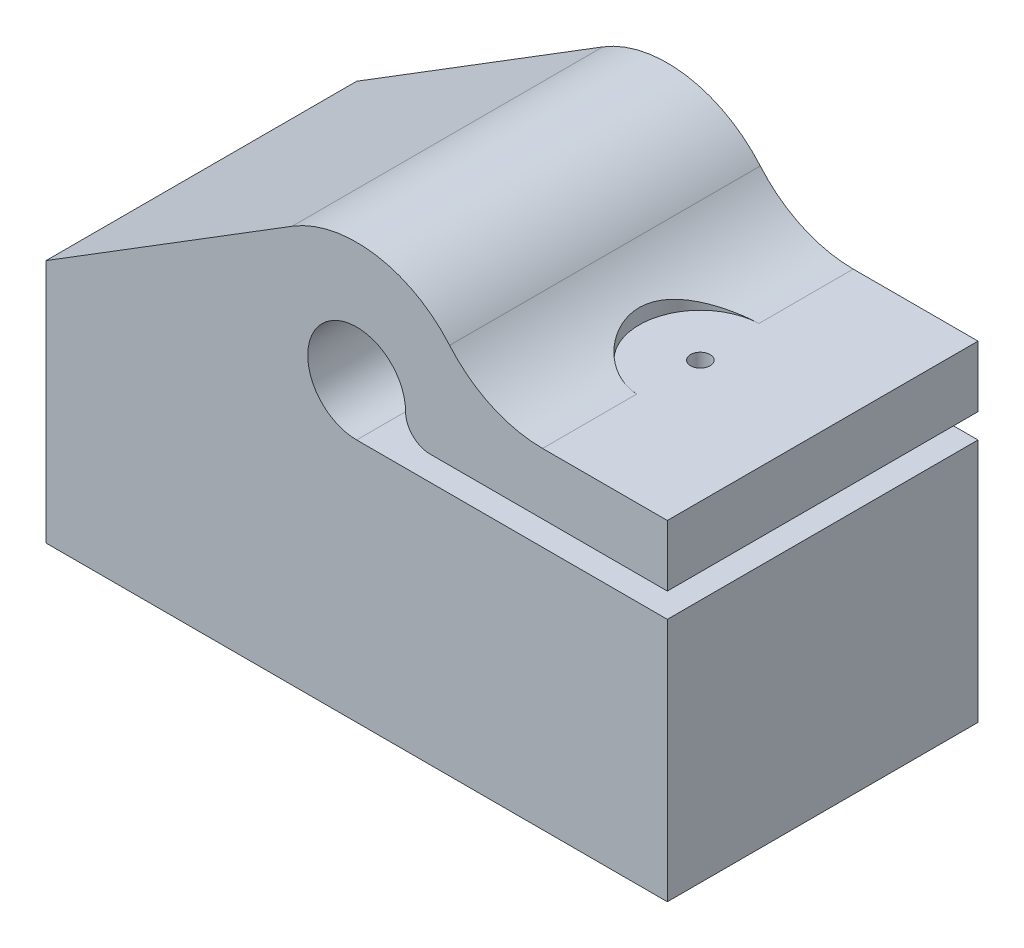
ISO-10303-21;
HEADER;
FILE_DESCRIPTION(('STEP AP214'),'2;1');
FILE_NAME('part.step','',(''),(''),'','','');
FILE_SCHEMA(('AUTOMOTIVE_DESIGN { 1 0 10303 214 1 1 1 1 }'));
ENDSEC;
DATA;
#1=APPLICATION_CONTEXT('core data for automotive mechanical design processes');
#2=APPLICATION_PROTOCOL_DEFINITION('international standard','automotive_design',2000,#1);
#3=PRODUCT_CONTEXT('',#1,'mechanical');
#4=PRODUCT('Part','Part','',(#3));
#5=PRODUCT_RELATED_PRODUCT_CATEGORY('part','',(#4));
#6=PRODUCT_DEFINITION_FORMATION('','',#4);
#7=PRODUCT_DEFINITION_CONTEXT('part definition',#1,'design');
#8=PRODUCT_DEFINITION('design','',#6,#7);
#9=PRODUCT_DEFINITION_SHAPE('','',#8);
#10=(LENGTH_UNIT() NAMED_UNIT(*) SI_UNIT(.MILLI.,.METRE.));
#11=(NAMED_UNIT(*) PLANE_ANGLE_UNIT() SI_UNIT($,.RADIAN.));
#12=(NAMED_UNIT(*) SI_UNIT($,.STERADIAN.) SOLID_ANGLE_UNIT());
#13=UNCERTAINTY_MEASURE_WITH_UNIT(LENGTH_MEASURE(1.E-05),#10,'distance_accuracy_value','');
#14=(GEOMETRIC_REPRESENTATION_CONTEXT(3) GLOBAL_UNCERTAINTY_ASSIGNED_CONTEXT((#13)) GLOBAL_UNIT_ASSIGNED_CONTEXT((#10,
#11,#12)) REPRESENTATION_CONTEXT('',''));
#15=CARTESIAN_POINT('',(0.,0.,0.));
#16=DIRECTION('',(0.,0.,1.));
#17=DIRECTION('',(1.,0.,0.));
#18=AXIS2_PLACEMENT_3D('',#15,#16,#17);
#19=CARTESIAN_POINT('',(15.1986841535707,37.,-12.7));
#20=DIRECTION('',(0.,0.,1.));
#21=DIRECTION('',(1.,0.,0.));
#22=AXIS2_PLACEMENT_3D('',#19,#20,#21);
#23=CYLINDRICAL_SURFACE('',#22,10.);
#24=CARTESIAN_POINT('',(15.1986841535707,27.,-4.99594554914047));
#25=CARTESIAN_POINT('',(15.0662430937923,26.9999759621016,-4.99063107458522));
#26=CARTESIAN_POINT('',(14.9340300295906,27.0026301938909,-4.98000717957809));
#27=CARTESIAN_POINT('',(14.6711156689518,27.0130663793227,-4.94835236536939));
#28=CARTESIAN_POINT('',(14.5404137461058,27.0208461246371,-4.92732592907521));
#29=CARTESIAN_POINT('',(14.2820456357146,27.0412587535313,-4.87519075299695));
#30=CARTESIAN_POINT('',(14.15436841515,27.0538695903065,-4.84412791398032));
#31=CARTESIAN_POINT('',(13.9023292263034,27.0835711376612,-4.77222753752435));
#32=CARTESIAN_POINT('',(13.7779674959563,27.1006621688118,-4.73138930064432));
#33=CARTESIAN_POINT('',(13.533554980544,27.1388328893712,-4.64040479766029));
#34=CARTESIAN_POINT('',(13.4134977564931,27.1599062978174,-4.59027319129681));
#35=CARTESIAN_POINT('',(13.1781682396829,27.2055162954345,-4.48110624784712));
#36=CARTESIAN_POINT('',(13.0628977689104,27.2300541879393,-4.42206755935392));
#37=CARTESIAN_POINT('',(12.7250784857075,27.3080157377881,-4.23219262924047));
#38=CARTESIAN_POINT('',(12.5105315951854,27.3657856634029,-4.08860119986002));
#39=CARTESIAN_POINT('',(12.094894425718,27.4912369068061,-3.76171821532098));
#40=CARTESIAN_POINT('',(11.89541911301,27.5593075521738,-3.576541618942));
#41=CARTESIAN_POINT('',(11.5288716847668,27.6956613718272,-3.1761551505696));
#42=CARTESIAN_POINT('',(11.3618179443599,27.763944644477,-2.96092836555726));
#43=CARTESIAN_POINT('',(11.1336887742154,27.8630789120946,-2.61145521458758));
#44=CARTESIAN_POINT('',(11.059537790054,27.8965275142369,-2.4862905533935));
#45=CARTESIAN_POINT('',(10.9221500750485,27.9602554968419,-2.22936116346352));
#46=CARTESIAN_POINT('',(10.8589085388205,27.9905362703417,-2.0975993737938));
#47=CARTESIAN_POINT('',(10.7439528493327,28.0468178194265,-1.82829432742782));
#48=CARTESIAN_POINT('',(10.6922359980713,28.0728195963779,-1.69075243287128));
#49=CARTESIAN_POINT('',(10.6009346647417,28.1194970826922,-1.41089164264465));
#50=CARTESIAN_POINT('',(10.5613430796309,28.1401759091296,-1.26857559812407));
#51=CARTESIAN_POINT('',(10.4970981596229,28.174110990205,-0.990215406426853));
#52=CARTESIAN_POINT('',(10.4716026154161,28.187780933807,-0.854416016463094));
#53=CARTESIAN_POINT('',(10.4319214347468,28.2091817932224,-0.580771700580493));
#54=CARTESIAN_POINT('',(10.4177301173324,28.2169156921304,-0.442927837638275));
#55=CARTESIAN_POINT('',(10.4008494829413,28.2261253767639,-0.166372421665222));
#56=CARTESIAN_POINT('',(10.3981564317246,28.2276031942474,-0.0276611649925869));
#57=CARTESIAN_POINT('',(10.4043027525998,28.2242425171998,0.249421483722094));
#58=CARTESIAN_POINT('',(10.4131414002359,28.2194044194535,0.387792896567023));
#59=CARTESIAN_POINT('',(10.440747518868,28.2044183827562,0.649062901913917));
#60=CARTESIAN_POINT('',(10.4584214862841,28.1948563753232,0.772112158323924));
#61=CARTESIAN_POINT('',(10.502769733146,28.171126442919,1.01613888468846));
#62=CARTESIAN_POINT('',(10.5294468710471,28.1569570551831,1.13711568381575));
#63=CARTESIAN_POINT('',(10.6225904065059,28.1081855092149,1.49574180562733));
#64=CARTESIAN_POINT('',(10.7021884090375,28.0673086100919,1.72926705213579));
#65=CARTESIAN_POINT('',(10.8975941486168,27.9715528640088,2.18942105482188));
#66=CARTESIAN_POINT('',(11.0147871662259,27.9161562946481,2.4153438268735));
#67=CARTESIAN_POINT('',(11.2809677145051,27.7982247695947,2.84562708709124));
#68=CARTESIAN_POINT('',(11.429970862486,27.7356863146042,3.04997691001524));
#69=CARTESIAN_POINT('',(11.7755730985782,27.602104158375,3.45579620356646));
#70=CARTESIAN_POINT('',(11.975672837947,27.5309084073496,3.65424055102898));
#71=CARTESIAN_POINT('',(12.4078729004774,27.3946600688899,4.01577343756965));
#72=CARTESIAN_POINT('',(12.6399880499268,27.3296103513292,4.17884550526044));
#73=CARTESIAN_POINT('',(13.0102842106896,27.2415409704556,4.39434213912745));
#74=CARTESIAN_POINT('',(13.1387366884238,27.2135491520369,4.46182101850124));
#75=CARTESIAN_POINT('',(13.4017150195449,27.1618694667398,4.58562328245292));
#76=CARTESIAN_POINT('',(13.5362379424071,27.1381795502786,4.64195198054176));
#77=CARTESIAN_POINT('',(13.8101677435065,27.0958995981779,4.74275293471808));
#78=CARTESIAN_POINT('',(13.9495661050862,27.0773011256639,4.78724480176304));
#79=CARTESIAN_POINT('',(14.2322655604843,27.0457927416337,4.8639310121244));
#80=CARTESIAN_POINT('',(14.3755642557404,27.0328794142942,4.89613273821151));
#81=CARTESIAN_POINT('',(14.6321551484818,27.015430176276,4.94199873151204));
#82=CARTESIAN_POINT('',(14.7449161831538,27.0096610058539,4.95820698361424));
#83=CARTESIAN_POINT('',(14.9712881609226,27.0019419712288,4.98288887832174));
#84=CARTESIAN_POINT('',(15.0848980675926,26.9999880342143,4.99137076375654));
#85=CARTESIAN_POINT('',(15.1986841535707,27.,4.99594554914047));
#86=B_SPLINE_CURVE_WITH_KNOTS('',3,(#24,#25,#26,#27,#28,#29,#30,#31,#32,#33,#34,#35,#36,#37,#38,
#39,#40,#41,#42,#43,#44,#45,#46,#47,#48,#49,#50,#51,#52,#53,#54,#55,#56,#57,#58,#59,#60,#61,#62,
#63,#64,#65,#66,#67,#68,#69,#70,#71,#72,#73,#74,#75,#76,#77,#78,#79,#80,#81,#82,#83,#84,#85),
.UNSPECIFIED.,.F.,.F.,(4,2,2,2,2,2,2,2,2,2,2,2,2,2,2,2,2,2,2,2,2,2,2,2,2,2,2,2,2,2,4),(0.,
0.397488975689097,0.794806805106717,1.19033265766508,1.5858868190065,1.98082224608614,
2.37590664514598,3.16610682904273,4.00442511284808,4.84321714011971,5.29056619981287,
5.73771770563348,6.1847644202313,6.63154874944102,7.04750658294624,7.46325524426011,
7.87886887448457,8.2944563958732,8.66805079748402,9.04176392494881,9.78865189685675,
10.5670327388214,11.3457966124307,12.2139832849508,13.0825733718149,13.5253890685259,
13.9679932349897,14.4098594741063,14.851459861844,15.1933411017427,15.5348571789958),.UNSPECIFIED.);
#87=CARTESIAN_POINT('',(15.1986841535707,27.,-4.99594554914047));
#88=VERTEX_POINT('',#87);
#89=CARTESIAN_POINT('',(15.1986841535707,27.,4.99594554914047));
#90=VERTEX_POINT('',#89);
#91=EDGE_CURVE('E11',#88,#90,#86,.T.);
#92=ORIENTED_EDGE('',*,*,#91,.F.);
#93=DIRECTION('',(0.,0.,-1.));
#94=VECTOR('',#93,1.);
#95=CARTESIAN_POINT('',(15.1986841535707,27.,12.7));
#96=LINE('',#95,#94);
#97=CARTESIAN_POINT('',(15.1986841535707,27.,-12.7));
#98=VERTEX_POINT('',#97);
#99=EDGE_CURVE('E142',#98,#88,#96,.F.);
#100=ORIENTED_EDGE('',*,*,#99,.F.);
#101=CARTESIAN_POINT('',(15.1986841535707,37.,-12.7));
#102=DIRECTION('',(0.,0.,1.));
#103=DIRECTION('',(1.,0.,0.));
#104=AXIS2_PLACEMENT_3D('',#101,#102,#103);
#105=CIRCLE('',#104,10.);
#106=CARTESIAN_POINT('',(7.59934207678533,30.5,-12.7));
#107=VERTEX_POINT('',#106);
#108=EDGE_CURVE('E158',#107,#98,#105,.T.);
#109=ORIENTED_EDGE('',*,*,#108,.F.);
#110=DIRECTION('',(0.,0.,1.));
#111=VECTOR('',#110,1.);
#112=CARTESIAN_POINT('',(7.59934207678533,30.5,-12.7));
#113=LINE('',#112,#111);
#114=CARTESIAN_POINT('',(7.59934207678533,30.5,12.7));
#115=VERTEX_POINT('',#114);
#116=EDGE_CURVE('E149',#115,#107,#113,.F.);
#117=ORIENTED_EDGE('',*,*,#116,.F.);
#118=CARTESIAN_POINT('',(15.1986841535707,37.,12.7));
#119=DIRECTION('',(0.,0.,-1.));
#120=DIRECTION('',(-1.,0.,0.));
#121=AXIS2_PLACEMENT_3D('',#118,#119,#120);
#122=CIRCLE('',#121,10.);
#123=CARTESIAN_POINT('',(15.1986841535707,27.,12.7));
#124=VERTEX_POINT('',#123);
#125=EDGE_CURVE('E151',#124,#115,#122,.T.);
#126=ORIENTED_EDGE('',*,*,#125,.F.);
#127=EDGE_CURVE('E144',#90,#124,#96,.F.);
#128=ORIENTED_EDGE('',*,*,#127,.F.);
#129=EDGE_LOOP('',(#92,#100,#109,#117,#126,#128));
#130=FACE_BOUND('',#129,.T.);
#131=ADVANCED_FACE('F34',(#130),#23,.F.);
#132=CARTESIAN_POINT('',(25.4,20.,12.7));
#133=DIRECTION('',(-1.,0.,0.));
#134=DIRECTION('',(0.,0.,1.));
#135=AXIS2_PLACEMENT_3D('',#132,#133,#134);
#136=PLANE('',#135);
#137=DIRECTION('',(0.,0.,-1.));
#138=VECTOR('',#137,1.);
#139=CARTESIAN_POINT('',(25.4,0.,12.7));
#140=LINE('',#139,#138);
#141=CARTESIAN_POINT('',(25.4,0.,12.7));
#142=VERTEX_POINT('',#141);
#143=CARTESIAN_POINT('',(25.4,0.,-12.7));
#144=VERTEX_POINT('',#143);
#145=EDGE_CURVE('E202',#142,#144,#140,.T.);
#146=ORIENTED_EDGE('',*,*,#145,.T.);
#147=DIRECTION('',(0.,-1.,0.));
#148=VECTOR('',#147,1.);
#149=CARTESIAN_POINT('',(25.4,20.,-12.7));
#150=LINE('',#149,#148);
#151=CARTESIAN_POINT('',(25.4,20.,-12.7));
#152=VERTEX_POINT('',#151);
#153=EDGE_CURVE('E153',#152,#144,#150,.T.);
#154=ORIENTED_EDGE('',*,*,#153,.F.);
#155=DIRECTION('',(0.,0.,-1.));
#156=VECTOR('',#155,1.);
#157=CARTESIAN_POINT('',(25.4,20.,12.7));
#158=LINE('',#157,#156);
#159=CARTESIAN_POINT('',(25.4,20.,12.7));
#160=VERTEX_POINT('',#159);
#161=EDGE_CURVE('E209',#160,#152,#158,.T.);
#162=ORIENTED_EDGE('',*,*,#161,.F.);
#163=DIRECTION('',(0.,-1.,0.));
#164=VECTOR('',#163,1.);
#165=CARTESIAN_POINT('',(25.4,20.,12.7));
#166=LINE('',#165,#164);
#167=EDGE_CURVE('E220',#160,#142,#166,.T.);
#168=ORIENTED_EDGE('',*,*,#167,.T.);
#169=EDGE_LOOP('',(#146,#154,#162,#168));
#170=FACE_BOUND('',#169,.T.);
#171=ADVANCED_FACE('F242',(#170),#136,.F.);
#172=CARTESIAN_POINT('',(-25.4,20.,-12.7));
#173=DIRECTION('',(0.,0.,1.));
#174=DIRECTION('',(1.,0.,0.));
#175=AXIS2_PLACEMENT_3D('',#172,#173,#174);
#176=PLANE('',#175);
#177=DIRECTION('',(-1.,0.,0.));
#178=VECTOR('',#177,1.);
#179=CARTESIAN_POINT('',(0.,22.,-12.7));
#180=LINE('',#179,#178);
#181=CARTESIAN_POINT('',(25.4,22.,-12.7));
#182=VERTEX_POINT('',#181);
#183=CARTESIAN_POINT('',(6.,22.,-12.7));
#184=VERTEX_POINT('',#183);
#185=EDGE_CURVE('E172',#182,#184,#180,.T.);
#186=ORIENTED_EDGE('',*,*,#185,.T.);
#187=CARTESIAN_POINT('',(6.,24.,-12.7));
#188=DIRECTION('',(0.,0.,1.));
#189=DIRECTION('',(1.,0.,0.));
#190=AXIS2_PLACEMENT_3D('',#187,#188,#189);
#191=CIRCLE('',#190,2.);
#192=CARTESIAN_POINT('',(4.,24.,-12.7));
#193=VERTEX_POINT('',#192);
#194=EDGE_CURVE('E47',#184,#193,#191,.F.);
#195=ORIENTED_EDGE('',*,*,#194,.T.);
#196=CARTESIAN_POINT('',(0.,24.,-12.7));
#197=DIRECTION('',(0.,0.,1.));
#198=DIRECTION('',(1.,0.,0.));
#199=AXIS2_PLACEMENT_3D('',#196,#197,#198);
#200=CIRCLE('',#199,4.);
#201=CARTESIAN_POINT('',(0.,20.,-12.7));
#202=VERTEX_POINT('',#201);
#203=EDGE_CURVE('E169',#193,#202,#200,.T.);
#204=ORIENTED_EDGE('',*,*,#203,.T.);
#205=DIRECTION('',(-1.,0.,0.));
#206=VECTOR('',#205,1.);
#207=CARTESIAN_POINT('',(-25.4,20.,-12.7));
#208=LINE('',#207,#206);
#209=EDGE_CURVE('E212',#152,#202,#208,.T.);
#210=ORIENTED_EDGE('',*,*,#209,.F.);
#211=ORIENTED_EDGE('',*,*,#153,.T.);
#212=DIRECTION('',(-1.,0.,0.));
#213=VECTOR('',#212,1.);
#214=CARTESIAN_POINT('',(-25.4,0.,-12.7));
#215=LINE('',#214,#213);
#216=CARTESIAN_POINT('',(-25.4,0.,-12.7));
#217=VERTEX_POINT('',#216);
#218=EDGE_CURVE('E223',#144,#217,#215,.T.);
#219=ORIENTED_EDGE('',*,*,#218,.T.);
#220=DIRECTION('',(0.,-1.,0.));
#221=VECTOR('',#220,1.);
#222=CARTESIAN_POINT('',(-25.4,20.,-12.7));
#223=LINE('',#222,#221);
#224=CARTESIAN_POINT('',(-25.4,20.,-12.7));
#225=VERTEX_POINT('',#224);
#226=EDGE_CURVE('E232',#225,#217,#223,.T.);
#227=ORIENTED_EDGE('',*,*,#226,.F.);
#228=DIRECTION('',(0.849561262830956,0.527489962650544,0.));
#229=VECTOR('',#228,1.);
#230=CARTESIAN_POINT('',(-16.0301405577066,25.8177167715798,-12.7));
#231=LINE('',#230,#229);
#232=CARTESIAN_POINT('',(-5.27489962650544,32.4956126283095,-12.7));
#233=VERTEX_POINT('',#232);
#234=EDGE_CURVE('E181',#225,#233,#231,.T.);
#235=ORIENTED_EDGE('',*,*,#234,.T.);
#236=CARTESIAN_POINT('',(0.,24.,-12.7));
#237=DIRECTION('',(0.,0.,1.));
#238=DIRECTION('',(1.,0.,0.));
#239=AXIS2_PLACEMENT_3D('',#236,#237,#238);
#240=CIRCLE('',#239,10.);
#241=EDGE_CURVE('E263',#107,#233,#240,.T.);
#242=ORIENTED_EDGE('',*,*,#241,.F.);
#243=ORIENTED_EDGE('',*,*,#108,.T.);
#244=DIRECTION('',(-1.,0.,0.));
#245=VECTOR('',#244,1.);
#246=CARTESIAN_POINT('',(0.,27.,-12.7));
#247=LINE('',#246,#245);
#248=CARTESIAN_POINT('',(25.4,27.,-12.7));
#249=VERTEX_POINT('',#248);
#250=EDGE_CURVE('E148',#249,#98,#247,.T.);
#251=ORIENTED_EDGE('',*,*,#250,.F.);
#252=DIRECTION('',(0.,1.,0.));
#253=VECTOR('',#252,1.);
#254=CARTESIAN_POINT('',(25.4,0.,-12.7));
#255=LINE('',#254,#253);
#256=EDGE_CURVE('E208',#182,#249,#255,.T.);
#257=ORIENTED_EDGE('',*,*,#256,.F.);
#258=EDGE_LOOP('',(#186,#195,#204,#210,#211,#219,#227,#235,#242,#243,#251,#257));
#259=FACE_BOUND('',#258,.T.);
#260=ADVANCED_FACE('F168',(#259),#176,.F.);
#261=CARTESIAN_POINT('',(-25.4,20.,12.7));
#262=DIRECTION('',(1.,0.,0.));
#263=DIRECTION('',(0.,0.,-1.));
#264=AXIS2_PLACEMENT_3D('',#261,#262,#263);
#265=PLANE('',#264);
#266=DIRECTION('',(0.,0.,1.));
#267=VECTOR('',#266,1.);
#268=CARTESIAN_POINT('',(-25.4,0.,12.7));
#269=LINE('',#268,#267);
#270=CARTESIAN_POINT('',(-25.4,0.,12.7));
#271=VERTEX_POINT('',#270);
#272=EDGE_CURVE('E225',#217,#271,#269,.T.);
#273=ORIENTED_EDGE('',*,*,#272,.T.);
#274=DIRECTION('',(0.,-1.,0.));
#275=VECTOR('',#274,1.);
#276=CARTESIAN_POINT('',(-25.4,20.,12.7));
#277=LINE('',#276,#275);
#278=CARTESIAN_POINT('',(-25.4,20.,12.7));
#279=VERTEX_POINT('',#278);
#280=EDGE_CURVE('E230',#279,#271,#277,.T.);
#281=ORIENTED_EDGE('',*,*,#280,.F.);
#282=DIRECTION('',(0.,0.,1.));
#283=VECTOR('',#282,1.);
#284=CARTESIAN_POINT('',(-25.4,20.,12.7));
#285=LINE('',#284,#283);
#286=EDGE_CURVE('E215',#225,#279,#285,.T.);
#287=ORIENTED_EDGE('',*,*,#286,.F.);
#288=ORIENTED_EDGE('',*,*,#226,.T.);
#289=EDGE_LOOP('',(#273,#281,#287,#288));
#290=FACE_BOUND('',#289,.T.);
#291=ADVANCED_FACE('F247',(#290),#265,.F.);
#292=CARTESIAN_POINT('',(-25.4,20.,12.7));
#293=DIRECTION('',(0.,0.,-1.));
#294=DIRECTION('',(-1.,0.,0.));
#295=AXIS2_PLACEMENT_3D('',#292,#293,#294);
#296=PLANE('',#295);
#297=CARTESIAN_POINT('',(0.,24.,12.7));
#298=DIRECTION('',(0.,0.,1.));
#299=DIRECTION('',(1.,0.,0.));
#300=AXIS2_PLACEMENT_3D('',#297,#298,#299);
#301=CIRCLE('',#300,4.);
#302=CARTESIAN_POINT('',(4.,24.,12.7));
#303=VERTEX_POINT('',#302);
#304=CARTESIAN_POINT('',(0.,20.,12.7));
#305=VERTEX_POINT('',#304);
#306=EDGE_CURVE('E190',#303,#305,#301,.T.);
#307=ORIENTED_EDGE('',*,*,#306,.F.);
#308=CARTESIAN_POINT('',(6.,24.,12.7));
#309=DIRECTION('',(0.,0.,-1.));
#310=DIRECTION('',(-1.,0.,0.));
#311=AXIS2_PLACEMENT_3D('',#308,#309,#310);
#312=CIRCLE('',#311,2.);
#313=CARTESIAN_POINT('',(6.,22.,12.7));
#314=VERTEX_POINT('',#313);
#315=EDGE_CURVE('E163',#303,#314,#312,.F.);
#316=ORIENTED_EDGE('',*,*,#315,.T.);
#317=DIRECTION('',(-1.,0.,0.));
#318=VECTOR('',#317,1.);
#319=CARTESIAN_POINT('',(0.,22.,12.7));
#320=LINE('',#319,#318);
#321=CARTESIAN_POINT('',(25.4,22.,12.7));
#322=VERTEX_POINT('',#321);
#323=EDGE_CURVE('E187',#322,#314,#320,.T.);
#324=ORIENTED_EDGE('',*,*,#323,.F.);
#325=DIRECTION('',(0.,1.,0.));
#326=VECTOR('',#325,1.);
#327=CARTESIAN_POINT('',(25.4,0.,12.7));
#328=LINE('',#327,#326);
#329=CARTESIAN_POINT('',(25.4,27.,12.7));
#330=VERTEX_POINT('',#329);
#331=EDGE_CURVE('E193',#322,#330,#328,.T.);
#332=ORIENTED_EDGE('',*,*,#331,.T.);
#333=DIRECTION('',(-1.,0.,0.));
#334=VECTOR('',#333,1.);
#335=CARTESIAN_POINT('',(0.,27.,12.7));
#336=LINE('',#335,#334);
#337=EDGE_CURVE('E136',#330,#124,#336,.T.);
#338=ORIENTED_EDGE('',*,*,#337,.T.);
#339=ORIENTED_EDGE('',*,*,#125,.T.);
#340=CARTESIAN_POINT('',(0.,24.,12.7));
#341=DIRECTION('',(0.,0.,1.));
#342=DIRECTION('',(1.,0.,0.));
#343=AXIS2_PLACEMENT_3D('',#340,#341,#342);
#344=CIRCLE('',#343,10.);
#345=CARTESIAN_POINT('',(-5.27489962650544,32.4956126283095,12.7));
#346=VERTEX_POINT('',#345);
#347=EDGE_CURVE('E251',#115,#346,#344,.T.);
#348=ORIENTED_EDGE('',*,*,#347,.T.);
#349=DIRECTION('',(0.849561262830956,0.527489962650544,0.));
#350=VECTOR('',#349,1.);
#351=CARTESIAN_POINT('',(-16.0301405577066,25.8177167715798,12.7));
#352=LINE('',#351,#350);
#353=EDGE_CURVE('E196',#279,#346,#352,.T.);
#354=ORIENTED_EDGE('',*,*,#353,.F.);
#355=ORIENTED_EDGE('',*,*,#280,.T.);
#356=DIRECTION('',(1.,0.,0.));
#357=VECTOR('',#356,1.);
#358=CARTESIAN_POINT('',(-25.4,0.,12.7));
#359=LINE('',#358,#357);
#360=EDGE_CURVE('E213',#271,#142,#359,.T.);
#361=ORIENTED_EDGE('',*,*,#360,.T.);
#362=ORIENTED_EDGE('',*,*,#167,.F.);
#363=DIRECTION('',(1.,0.,0.));
#364=VECTOR('',#363,1.);
#365=CARTESIAN_POINT('',(-25.4,20.,12.7));
#366=LINE('',#365,#364);
#367=EDGE_CURVE('E218',#305,#160,#366,.T.);
#368=ORIENTED_EDGE('',*,*,#367,.F.);
#369=EDGE_LOOP('',(#307,#316,#324,#332,#338,#339,#348,#354,#355,#361,#362,#368));
#370=FACE_BOUND('',#369,.T.);
#371=ADVANCED_FACE('F185',(#370),#296,.F.);
#372=CARTESIAN_POINT('',(0.,20.,0.));
#373=DIRECTION('',(0.,-1.,0.));
#374=DIRECTION('',(0.,0.,-1.));
#375=AXIS2_PLACEMENT_3D('',#372,#373,#374);
#376=PLANE('',#375);
#377=CARTESIAN_POINT('',(15.4,20.,0.));
#378=DIRECTION('',(0.,-1.,0.));
#379=DIRECTION('',(0.,0.,-1.));
#380=AXIS2_PLACEMENT_3D('',#377,#378,#379);
#381=CIRCLE('',#380,0.799999999999992);
#382=CARTESIAN_POINT('',(15.4,20.,-0.799999999999992));
#383=VERTEX_POINT('',#382);
#384=EDGE_CURVE('E137',#383,#383,#381,.T.);
#385=ORIENTED_EDGE('',*,*,#384,.T.);
#386=EDGE_LOOP('',(#385));
#387=FACE_BOUND('',#386,.T.);
#388=ORIENTED_EDGE('',*,*,#209,.T.);
#389=DIRECTION('',(0.,0.,1.));
#390=VECTOR('',#389,1.);
#391=CARTESIAN_POINT('',(0.,20.,-12.7));
#392=LINE('',#391,#390);
#393=EDGE_CURVE('E180',#202,#305,#392,.T.);
#394=ORIENTED_EDGE('',*,*,#393,.T.);
#395=ORIENTED_EDGE('',*,*,#367,.T.);
#396=ORIENTED_EDGE('',*,*,#161,.T.);
#397=EDGE_LOOP('',(#388,#394,#395,#396));
#398=FACE_BOUND('',#397,.T.);
#399=ADVANCED_FACE('F290',(#387,#398),#376,.F.);
#400=CARTESIAN_POINT('',(0.,0.,0.));
#401=DIRECTION('',(0.,-1.,0.));
#402=DIRECTION('',(0.,0.,-1.));
#403=AXIS2_PLACEMENT_3D('',#400,#401,#402);
#404=PLANE('',#403);
#405=CARTESIAN_POINT('',(15.4,0.,0.));
#406=DIRECTION('',(0.,1.,0.));
#407=DIRECTION('',(0.,0.,1.));
#408=AXIS2_PLACEMENT_3D('',#405,#406,#407);
#409=CIRCLE('',#408,0.799999999999995);
#410=CARTESIAN_POINT('',(15.4,0.,0.799999999999995));
#411=VERTEX_POINT('',#410);
#412=EDGE_CURVE('E271',#411,#411,#409,.T.);
#413=ORIENTED_EDGE('',*,*,#412,.T.);
#414=EDGE_LOOP('',(#413));
#415=FACE_BOUND('',#414,.T.);
#416=ORIENTED_EDGE('',*,*,#145,.F.);
#417=ORIENTED_EDGE('',*,*,#360,.F.);
#418=ORIENTED_EDGE('',*,*,#272,.F.);
#419=ORIENTED_EDGE('',*,*,#218,.F.);
#420=EDGE_LOOP('',(#416,#417,#418,#419));
#421=FACE_BOUND('',#420,.T.);
#422=ADVANCED_FACE('F246',(#415,#421),#404,.T.);
#423=CARTESIAN_POINT('',(0.,27.,-12.7));
#424=DIRECTION('',(0.,1.,0.));
#425=DIRECTION('',(0.,0.,1.));
#426=AXIS2_PLACEMENT_3D('',#423,#424,#425);
#427=PLANE('',#426);
#428=CARTESIAN_POINT('',(15.4,27.,0.));
#429=DIRECTION('',(0.,1.,0.));
#430=DIRECTION('',(0.,0.,1.));
#431=AXIS2_PLACEMENT_3D('',#428,#429,#430);
#432=CIRCLE('',#431,0.799999999999988);
#433=CARTESIAN_POINT('',(15.4,27.,0.799999999999988));
#434=VERTEX_POINT('',#433);
#435=EDGE_CURVE('E274',#434,#434,#432,.T.);
#436=ORIENTED_EDGE('',*,*,#435,.F.);
#437=EDGE_LOOP('',(#436));
#438=FACE_BOUND('',#437,.T.);
#439=ORIENTED_EDGE('',*,*,#99,.T.);
#440=CARTESIAN_POINT('',(15.4,27.,0.));
#441=DIRECTION('',(0.,1.,0.));
#442=DIRECTION('',(0.,0.,1.));
#443=AXIS2_PLACEMENT_3D('',#440,#441,#442);
#444=CIRCLE('',#443,5.);
#445=EDGE_CURVE('E54',#88,#90,#444,.T.);
#446=ORIENTED_EDGE('',*,*,#445,.T.);
#447=ORIENTED_EDGE('',*,*,#127,.T.);
#448=ORIENTED_EDGE('',*,*,#337,.F.);
#449=DIRECTION('',(0.,0.,1.));
#450=VECTOR('',#449,1.);
#451=CARTESIAN_POINT('',(25.4,27.,-12.7));
#452=LINE('',#451,#450);
#453=EDGE_CURVE('E200',#249,#330,#452,.T.);
#454=ORIENTED_EDGE('',*,*,#453,.F.);
#455=ORIENTED_EDGE('',*,*,#250,.T.);
#456=EDGE_LOOP('',(#439,#446,#447,#448,#454,#455));
#457=FACE_BOUND('',#456,.T.);
#458=ADVANCED_FACE('F146',(#438,#457),#427,.T.);
#459=CARTESIAN_POINT('',(25.4,0.,-12.7));
#460=DIRECTION('',(1.,0.,0.));
#461=DIRECTION('',(0.,0.,-1.));
#462=AXIS2_PLACEMENT_3D('',#459,#460,#461);
#463=PLANE('',#462);
#464=ORIENTED_EDGE('',*,*,#331,.F.);
#465=DIRECTION('',(0.,0.,1.));
#466=VECTOR('',#465,1.);
#467=CARTESIAN_POINT('',(25.4,22.,-12.7));
#468=LINE('',#467,#466);
#469=EDGE_CURVE('E192',#182,#322,#468,.T.);
#470=ORIENTED_EDGE('',*,*,#469,.F.);
#471=ORIENTED_EDGE('',*,*,#256,.T.);
#472=ORIENTED_EDGE('',*,*,#453,.T.);
#473=EDGE_LOOP('',(#464,#470,#471,#472));
#474=FACE_BOUND('',#473,.T.);
#475=ADVANCED_FACE('F282',(#474),#463,.T.);
#476=CARTESIAN_POINT('',(0.,22.,-12.7));
#477=DIRECTION('',(0.,1.,0.));
#478=DIRECTION('',(0.,0.,1.));
#479=AXIS2_PLACEMENT_3D('',#476,#477,#478);
#480=PLANE('',#479);
#481=CARTESIAN_POINT('',(15.4,22.,0.));
#482=DIRECTION('',(0.,1.,0.));
#483=DIRECTION('',(0.,0.,1.));
#484=AXIS2_PLACEMENT_3D('',#481,#482,#483);
#485=CIRCLE('',#484,0.799999999999992);
#486=CARTESIAN_POINT('',(15.4,22.,0.799999999999992));
#487=VERTEX_POINT('',#486);
#488=EDGE_CURVE('E268',#487,#487,#485,.T.);
#489=ORIENTED_EDGE('',*,*,#488,.T.);
#490=EDGE_LOOP('',(#489));
#491=FACE_BOUND('',#490,.T.);
#492=ORIENTED_EDGE('',*,*,#323,.T.);
#493=DIRECTION('',(0.,0.,1.));
#494=VECTOR('',#493,1.);
#495=CARTESIAN_POINT('',(6.,22.,-12.7));
#496=LINE('',#495,#494);
#497=EDGE_CURVE('E61',#314,#184,#496,.F.);
#498=ORIENTED_EDGE('',*,*,#497,.T.);
#499=ORIENTED_EDGE('',*,*,#185,.F.);
#500=ORIENTED_EDGE('',*,*,#469,.T.);
#501=EDGE_LOOP('',(#492,#498,#499,#500));
#502=FACE_BOUND('',#501,.T.);
#503=ADVANCED_FACE('F191',(#491,#502),#480,.F.);
#504=CARTESIAN_POINT('',(0.,24.,-12.7));
#505=DIRECTION('',(0.,0.,1.));
#506=DIRECTION('',(1.,0.,0.));
#507=AXIS2_PLACEMENT_3D('',#504,#505,#506);
#508=CYLINDRICAL_SURFACE('',#507,4.);
#509=ORIENTED_EDGE('',*,*,#203,.F.);
#510=DIRECTION('',(0.,0.,1.));
#511=VECTOR('',#510,1.);
#512=CARTESIAN_POINT('',(4.,24.,-12.7));
#513=LINE('',#512,#511);
#514=EDGE_CURVE('E160',#193,#303,#513,.T.);
#515=ORIENTED_EDGE('',*,*,#514,.T.);
#516=ORIENTED_EDGE('',*,*,#306,.T.);
#517=ORIENTED_EDGE('',*,*,#393,.F.);
#518=EDGE_LOOP('',(#509,#515,#516,#517));
#519=FACE_BOUND('',#518,.T.);
#520=ADVANCED_FACE('F177',(#519),#508,.F.);
#521=CARTESIAN_POINT('',(-16.0301405577066,25.8177167715798,-12.7));
#522=DIRECTION('',(0.527489962650544,-0.849561262830955,0.));
#523=DIRECTION('',(0.849561262830956,0.527489962650544,0.));
#524=AXIS2_PLACEMENT_3D('',#521,#522,#523);
#525=PLANE('',#524);
#526=ORIENTED_EDGE('',*,*,#353,.T.);
#527=DIRECTION('',(0.,0.,1.));
#528=VECTOR('',#527,1.);
#529=CARTESIAN_POINT('',(-5.27489962650544,32.4956126283095,-12.7));
#530=LINE('',#529,#528);
#531=EDGE_CURVE('E205',#233,#346,#530,.T.);
#532=ORIENTED_EDGE('',*,*,#531,.F.);
#533=ORIENTED_EDGE('',*,*,#234,.F.);
#534=ORIENTED_EDGE('',*,*,#286,.T.);
#535=EDGE_LOOP('',(#526,#532,#533,#534));
#536=FACE_BOUND('',#535,.T.);
#537=ADVANCED_FACE('F330',(#536),#525,.F.);
#538=CARTESIAN_POINT('',(0.,24.,-12.7));
#539=DIRECTION('',(0.,0.,1.));
#540=DIRECTION('',(1.,0.,0.));
#541=AXIS2_PLACEMENT_3D('',#538,#539,#540);
#542=CYLINDRICAL_SURFACE('',#541,10.);
#543=ORIENTED_EDGE('',*,*,#347,.F.);
#544=ORIENTED_EDGE('',*,*,#116,.T.);
#545=ORIENTED_EDGE('',*,*,#241,.T.);
#546=ORIENTED_EDGE('',*,*,#531,.T.);
#547=EDGE_LOOP('',(#543,#544,#545,#546));
#548=FACE_BOUND('',#547,.T.);
#549=ADVANCED_FACE('F332',(#548),#542,.T.);
#550=CARTESIAN_POINT('',(6.,24.,-12.7));
#551=DIRECTION('',(0.,0.,1.));
#552=DIRECTION('',(1.,0.,0.));
#553=AXIS2_PLACEMENT_3D('',#550,#551,#552);
#554=CYLINDRICAL_SURFACE('',#553,2.);
#555=ORIENTED_EDGE('',*,*,#194,.F.);
#556=ORIENTED_EDGE('',*,*,#497,.F.);
#557=ORIENTED_EDGE('',*,*,#315,.F.);
#558=ORIENTED_EDGE('',*,*,#514,.F.);
#559=EDGE_LOOP('',(#555,#556,#557,#558));
#560=FACE_BOUND('',#559,.T.);
#561=ADVANCED_FACE('F36',(#560),#554,.T.);
#562=CARTESIAN_POINT('',(15.4,34.,0.));
#563=DIRECTION('',(0.,-1.,0.));
#564=DIRECTION('',(0.,0.,-1.));
#565=AXIS2_PLACEMENT_3D('',#562,#563,#564);
#566=CYLINDRICAL_SURFACE('',#565,5.);
#567=ORIENTED_EDGE('',*,*,#91,.T.);
#568=ORIENTED_EDGE('',*,*,#445,.F.);
#569=EDGE_LOOP('',(#567,#568));
#570=FACE_BOUND('',#569,.T.);
#571=ADVANCED_FACE('F134',(#570),#566,.F.);
#572=CARTESIAN_POINT('',(15.4,27.,0.));
#573=DIRECTION('',(0.,1.,0.));
#574=DIRECTION('',(0.,0.,1.));
#575=AXIS2_PLACEMENT_3D('',#572,#573,#574);
#576=CYLINDRICAL_SURFACE('',#575,0.799999999999992);
#577=ORIENTED_EDGE('',*,*,#435,.T.);
#578=EDGE_LOOP('',(#577));
#579=FACE_BOUND('',#578,.T.);
#580=ORIENTED_EDGE('',*,*,#488,.F.);
#581=EDGE_LOOP('',(#580));
#582=FACE_BOUND('',#581,.T.);
#583=ADVANCED_FACE('F278',(#579,#582),#576,.F.);
#584=ORIENTED_EDGE('',*,*,#412,.F.);
#585=EDGE_LOOP('',(#584));
#586=FACE_BOUND('',#585,.T.);
#587=ORIENTED_EDGE('',*,*,#384,.F.);
#588=EDGE_LOOP('',(#587));
#589=FACE_BOUND('',#588,.T.);
#590=ADVANCED_FACE('F314',(#586,#589),#576,.F.);
#591=CLOSED_SHELL('',(#131,#171,#260,#291,#371,#399,#422,#458,#475,#503,#520,#537,#549,#561,
#571,#583,#590));
#592=MANIFOLD_SOLID_BREP('B2',#591);
#593=ADVANCED_BREP_SHAPE_REPRESENTATION('',(#18,#592),#14);
#594=SHAPE_DEFINITION_REPRESENTATION(#9,#593);
ENDSEC;
END-ISO-10303-21;
